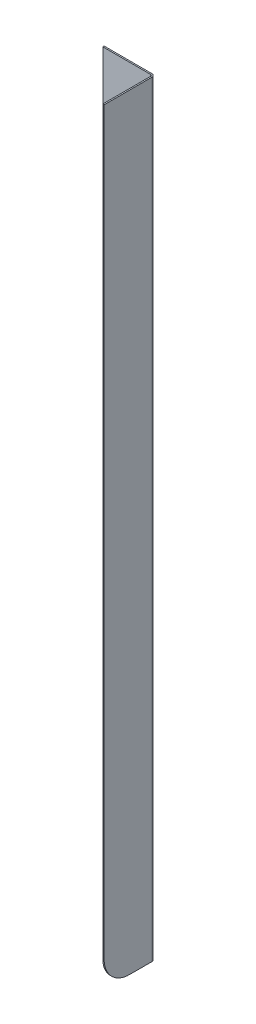
ISO-10303-21;
HEADER;
FILE_DESCRIPTION(('STEP AP214'),'2;1');
FILE_NAME('part.step','',(''),(''),'','','');
FILE_SCHEMA(('AUTOMOTIVE_DESIGN { 1 0 10303 214 1 1 1 1 }'));
ENDSEC;
DATA;
#1=APPLICATION_CONTEXT('core data for automotive mechanical design processes');
#2=APPLICATION_PROTOCOL_DEFINITION('international standard','automotive_design',2000,#1);
#3=PRODUCT_CONTEXT('',#1,'mechanical');
#4=PRODUCT('Part','Part','',(#3));
#5=PRODUCT_RELATED_PRODUCT_CATEGORY('part','',(#4));
#6=PRODUCT_DEFINITION_FORMATION('','',#4);
#7=PRODUCT_DEFINITION_CONTEXT('part definition',#1,'design');
#8=PRODUCT_DEFINITION('design','',#6,#7);
#9=PRODUCT_DEFINITION_SHAPE('','',#8);
#10=(LENGTH_UNIT() NAMED_UNIT(*) SI_UNIT(.MILLI.,.METRE.));
#11=(NAMED_UNIT(*) PLANE_ANGLE_UNIT() SI_UNIT($,.RADIAN.));
#12=(NAMED_UNIT(*) SI_UNIT($,.STERADIAN.) SOLID_ANGLE_UNIT());
#13=UNCERTAINTY_MEASURE_WITH_UNIT(LENGTH_MEASURE(1.E-05),#10,'distance_accuracy_value','');
#14=(GEOMETRIC_REPRESENTATION_CONTEXT(3) GLOBAL_UNCERTAINTY_ASSIGNED_CONTEXT((#13)) GLOBAL_UNIT_ASSIGNED_CONTEXT((#10,
#11,#12)) REPRESENTATION_CONTEXT('',''));
#15=CARTESIAN_POINT('',(0.,0.,0.));
#16=DIRECTION('',(0.,0.,1.));
#17=DIRECTION('',(1.,0.,0.));
#18=AXIS2_PLACEMENT_3D('',#15,#16,#17);
#19=CARTESIAN_POINT('',(0.700442571243631,-210.,-14.2995574287564));
#20=DIRECTION('',(-1.,0.,0.));
#21=DIRECTION('',(0.,0.,1.));
#22=AXIS2_PLACEMENT_3D('',#19,#20,#21);
#23=PLANE('',#22);
#24=DIRECTION('',(0.,0.,1.));
#25=VECTOR('',#24,1.);
#26=CARTESIAN_POINT('',(0.700442571243632,-225.,-14.2995574287563));
#27=LINE('',#26,#25);
#28=CARTESIAN_POINT('',(0.700442571243579,-225.,1.00000000000001));
#29=VERTEX_POINT('',#28);
#30=CARTESIAN_POINT('',(0.700442571243533,-225.,14.1004425712435));
#31=VERTEX_POINT('',#30);
#32=EDGE_CURVE('E48',#29,#31,#27,.T.);
#33=ORIENTED_EDGE('',*,*,#32,.F.);
#34=DIRECTION('',(0.,1.,0.));
#35=VECTOR('',#34,1.);
#36=CARTESIAN_POINT('',(0.700442571243577,-210.,1.00000000000003));
#37=LINE('',#36,#35);
#38=CARTESIAN_POINT('',(0.700442571243552,225.,1.00000000000008));
#39=VERTEX_POINT('',#38);
#40=EDGE_CURVE('E147',#29,#39,#37,.T.);
#41=ORIENTED_EDGE('',*,*,#40,.T.);
#42=DIRECTION('',(0.,0.,-1.));
#43=VECTOR('',#42,1.);
#44=CARTESIAN_POINT('',(0.700442571243633,225.,-29.2995574287564));
#45=LINE('',#44,#43);
#46=CARTESIAN_POINT('',(0.700442571243429,225.,29.1004425712436));
#47=VERTEX_POINT('',#46);
#48=EDGE_CURVE('E180',#47,#39,#45,.T.);
#49=ORIENTED_EDGE('',*,*,#48,.F.);
#50=DIRECTION('',(0.,1.,0.));
#51=VECTOR('',#50,1.);
#52=CARTESIAN_POINT('',(0.700442571243429,225.,29.1004425712436));
#53=LINE('',#52,#51);
#54=CARTESIAN_POINT('',(0.700442571243479,-210.,29.1004425712436));
#55=VERTEX_POINT('',#54);
#56=EDGE_CURVE('E177',#55,#47,#53,.T.);
#57=ORIENTED_EDGE('',*,*,#56,.F.);
#58=CARTESIAN_POINT('',(0.700442571243532,-210.,14.1004425712436));
#59=DIRECTION('',(-1.,0.,0.));
#60=DIRECTION('',(0.,0.,1.));
#61=AXIS2_PLACEMENT_3D('',#58,#59,#60);
#62=CIRCLE('',#61,15.);
#63=EDGE_CURVE('E174',#31,#55,#62,.T.);
#64=ORIENTED_EDGE('',*,*,#63,.F.);
#65=EDGE_LOOP('',(#33,#41,#49,#57,#64));
#66=FACE_BOUND('',#65,.T.);
#67=ADVANCED_FACE('F44',(#66),#23,.F.);
#68=CARTESIAN_POINT('',(0.700442571243633,225.,-29.2995574287564));
#69=DIRECTION('',(0.,1.,0.));
#70=DIRECTION('',(-1.,0.,0.));
#71=AXIS2_PLACEMENT_3D('',#68,#69,#70);
#72=PLANE('',#71);
#73=DIRECTION('',(1.,0.,0.));
#74=VECTOR('',#73,1.);
#75=CARTESIAN_POINT('',(0.700442571243527,225.,1.00000000000003));
#76=LINE('',#75,#74);
#77=CARTESIAN_POINT('',(-0.0995574287564731,225.,1.00000000000006));
#78=VERTEX_POINT('',#77);
#79=EDGE_CURVE('E12',#78,#39,#76,.T.);
#80=ORIENTED_EDGE('',*,*,#79,.F.);
#81=DIRECTION('',(0.,0.,-1.));
#82=VECTOR('',#81,1.);
#83=CARTESIAN_POINT('',(-0.0995574287563673,225.,-29.2995574287564));
#84=LINE('',#83,#82);
#85=CARTESIAN_POINT('',(-0.0995574287565712,225.,29.1004425712436));
#86=VERTEX_POINT('',#85);
#87=EDGE_CURVE('E61',#86,#78,#84,.T.);
#88=ORIENTED_EDGE('',*,*,#87,.F.);
#89=DIRECTION('',(-1.,0.,0.));
#90=VECTOR('',#89,1.);
#91=CARTESIAN_POINT('',(0.700442571243429,225.,29.1004425712436));
#92=LINE('',#91,#90);
#93=EDGE_CURVE('E186',#47,#86,#92,.T.);
#94=ORIENTED_EDGE('',*,*,#93,.F.);
#95=ORIENTED_EDGE('',*,*,#48,.T.);
#96=EDGE_LOOP('',(#80,#88,#94,#95));
#97=FACE_BOUND('',#96,.T.);
#98=ADVANCED_FACE('F46',(#97),#72,.T.);
#99=CARTESIAN_POINT('',(0.700442571243429,225.,29.1004425712436));
#100=DIRECTION('',(0.,0.,1.));
#101=DIRECTION('',(0.,1.,0.));
#102=AXIS2_PLACEMENT_3D('',#99,#100,#101);
#103=PLANE('',#102);
#104=DIRECTION('',(0.,1.,0.));
#105=VECTOR('',#104,1.);
#106=CARTESIAN_POINT('',(-0.0995574287565712,225.,29.1004425712436));
#107=LINE('',#106,#105);
#108=CARTESIAN_POINT('',(-0.0995574287565209,-210.,29.1004425712436));
#109=VERTEX_POINT('',#108);
#110=EDGE_CURVE('E184',#109,#86,#107,.T.);
#111=ORIENTED_EDGE('',*,*,#110,.F.);
#112=DIRECTION('',(-1.,0.,0.));
#113=VECTOR('',#112,1.);
#114=CARTESIAN_POINT('',(0.700442571243479,-210.,29.1004425712436));
#115=LINE('',#114,#113);
#116=EDGE_CURVE('E188',#55,#109,#115,.T.);
#117=ORIENTED_EDGE('',*,*,#116,.F.);
#118=ORIENTED_EDGE('',*,*,#56,.T.);
#119=ORIENTED_EDGE('',*,*,#93,.T.);
#120=EDGE_LOOP('',(#111,#117,#118,#119));
#121=FACE_BOUND('',#120,.T.);
#122=ADVANCED_FACE('F245',(#121),#103,.T.);
#123=CARTESIAN_POINT('',(0.700442571243532,-210.,14.1004425712436));
#124=DIRECTION('',(-1.,0.,0.));
#125=DIRECTION('',(0.,0.,1.));
#126=AXIS2_PLACEMENT_3D('',#123,#124,#125);
#127=CYLINDRICAL_SURFACE('',#126,15.);
#128=CARTESIAN_POINT('',(-0.0995574287564685,-210.,14.1004425712436));
#129=DIRECTION('',(-1.,0.,0.));
#130=DIRECTION('',(0.,0.,1.));
#131=AXIS2_PLACEMENT_3D('',#128,#129,#130);
#132=CIRCLE('',#131,15.);
#133=CARTESIAN_POINT('',(-0.0995574287564668,-225.,14.1004425712435));
#134=VERTEX_POINT('',#133);
#135=EDGE_CURVE('E181',#134,#109,#132,.T.);
#136=ORIENTED_EDGE('',*,*,#135,.F.);
#137=DIRECTION('',(-1.,0.,0.));
#138=VECTOR('',#137,1.);
#139=CARTESIAN_POINT('',(0.700442571243533,-225.,14.1004425712435));
#140=LINE('',#139,#138);
#141=EDGE_CURVE('E190',#31,#134,#140,.T.);
#142=ORIENTED_EDGE('',*,*,#141,.F.);
#143=ORIENTED_EDGE('',*,*,#63,.T.);
#144=ORIENTED_EDGE('',*,*,#116,.T.);
#145=EDGE_LOOP('',(#136,#142,#143,#144));
#146=FACE_BOUND('',#145,.T.);
#147=ADVANCED_FACE('F249',(#146),#127,.T.);
#148=CARTESIAN_POINT('',(0.700442571243632,-225.,-14.2995574287563));
#149=DIRECTION('',(0.,-1.,0.));
#150=DIRECTION('',(1.,0.,0.));
#151=AXIS2_PLACEMENT_3D('',#148,#149,#150);
#152=PLANE('',#151);
#153=DIRECTION('',(-1.,0.,0.));
#154=VECTOR('',#153,1.);
#155=CARTESIAN_POINT('',(0.700442571243579,-225.,1.00000000000003));
#156=LINE('',#155,#154);
#157=CARTESIAN_POINT('',(-0.099557428756421,-225.,1.));
#158=VERTEX_POINT('',#157);
#159=EDGE_CURVE('E193',#29,#158,#156,.T.);
#160=ORIENTED_EDGE('',*,*,#159,.F.);
#161=ORIENTED_EDGE('',*,*,#32,.T.);
#162=ORIENTED_EDGE('',*,*,#141,.T.);
#163=DIRECTION('',(0.,0.,1.));
#164=VECTOR('',#163,1.);
#165=CARTESIAN_POINT('',(-0.0995574287563676,-225.,-14.2995574287563));
#166=LINE('',#165,#164);
#167=EDGE_CURVE('E69',#158,#134,#166,.T.);
#168=ORIENTED_EDGE('',*,*,#167,.F.);
#169=EDGE_LOOP('',(#160,#161,#162,#168));
#170=FACE_BOUND('',#169,.T.);
#171=ADVANCED_FACE('F237',(#170),#152,.T.);
#172=CARTESIAN_POINT('',(-0.0995574287563694,-210.,-14.2995574287564));
#173=DIRECTION('',(-1.,0.,0.));
#174=DIRECTION('',(0.,0.,1.));
#175=AXIS2_PLACEMENT_3D('',#172,#173,#174);
#176=PLANE('',#175);
#177=DIRECTION('',(0.,1.,0.));
#178=VECTOR('',#177,1.);
#179=CARTESIAN_POINT('',(-0.0995574287564228,-210.,1.00000000000003));
#180=LINE('',#179,#178);
#181=EDGE_CURVE('E53',#158,#78,#180,.T.);
#182=ORIENTED_EDGE('',*,*,#181,.F.);
#183=ORIENTED_EDGE('',*,*,#167,.T.);
#184=ORIENTED_EDGE('',*,*,#135,.T.);
#185=ORIENTED_EDGE('',*,*,#110,.T.);
#186=ORIENTED_EDGE('',*,*,#87,.T.);
#187=EDGE_LOOP('',(#182,#183,#184,#185,#186));
#188=FACE_BOUND('',#187,.T.);
#189=ADVANCED_FACE('F230',(#188),#176,.T.);
#190=CARTESIAN_POINT('',(-29.2,225.,-0.8));
#191=DIRECTION('',(-1.,0.,0.));
#192=DIRECTION('',(0.,-1.,0.));
#193=AXIS2_PLACEMENT_3D('',#190,#191,#192);
#194=PLANE('',#193);
#195=DIRECTION('',(0.,-1.,0.));
#196=VECTOR('',#195,1.);
#197=CARTESIAN_POINT('',(-29.2,225.,0.));
#198=LINE('',#197,#196);
#199=CARTESIAN_POINT('',(-29.2,225.,0.));
#200=VERTEX_POINT('',#199);
#201=CARTESIAN_POINT('',(-29.2,-210.,0.));
#202=VERTEX_POINT('',#201);
#203=EDGE_CURVE('E214',#200,#202,#198,.T.);
#204=ORIENTED_EDGE('',*,*,#203,.F.);
#205=DIRECTION('',(0.,0.,1.));
#206=VECTOR('',#205,1.);
#207=CARTESIAN_POINT('',(-29.2,225.,-0.8));
#208=LINE('',#207,#206);
#209=CARTESIAN_POINT('',(-29.2,225.,-0.8));
#210=VERTEX_POINT('',#209);
#211=EDGE_CURVE('E198',#210,#200,#208,.T.);
#212=ORIENTED_EDGE('',*,*,#211,.F.);
#213=DIRECTION('',(0.,-1.,0.));
#214=VECTOR('',#213,1.);
#215=CARTESIAN_POINT('',(-29.2,225.,-0.8));
#216=LINE('',#215,#214);
#217=CARTESIAN_POINT('',(-29.2,-210.,-0.8));
#218=VERTEX_POINT('',#217);
#219=EDGE_CURVE('E160',#210,#218,#216,.T.);
#220=ORIENTED_EDGE('',*,*,#219,.T.);
#221=DIRECTION('',(0.,0.,1.));
#222=VECTOR('',#221,1.);
#223=CARTESIAN_POINT('',(-29.2,-210.,-0.8));
#224=LINE('',#223,#222);
#225=EDGE_CURVE('E170',#218,#202,#224,.T.);
#226=ORIENTED_EDGE('',*,*,#225,.T.);
#227=EDGE_LOOP('',(#204,#212,#220,#226));
#228=FACE_BOUND('',#227,.T.);
#229=ADVANCED_FACE('F228',(#228),#194,.T.);
#230=CARTESIAN_POINT('',(-14.2,-210.,-0.8));
#231=DIRECTION('',(0.,0.,1.));
#232=DIRECTION('',(1.,0.,0.));
#233=AXIS2_PLACEMENT_3D('',#230,#231,#232);
#234=CYLINDRICAL_SURFACE('',#233,15.);
#235=CARTESIAN_POINT('',(-14.2,-210.,0.));
#236=DIRECTION('',(0.,0.,1.));
#237=DIRECTION('',(1.,0.,0.));
#238=AXIS2_PLACEMENT_3D('',#235,#236,#237);
#239=CIRCLE('',#238,15.);
#240=CARTESIAN_POINT('',(-14.1999999999999,-225.,0.));
#241=VERTEX_POINT('',#240);
#242=EDGE_CURVE('E211',#202,#241,#239,.T.);
#243=ORIENTED_EDGE('',*,*,#242,.F.);
#244=ORIENTED_EDGE('',*,*,#225,.F.);
#245=CARTESIAN_POINT('',(-14.2,-210.,-0.8));
#246=DIRECTION('',(0.,0.,1.));
#247=DIRECTION('',(1.,0.,0.));
#248=AXIS2_PLACEMENT_3D('',#245,#246,#247);
#249=CIRCLE('',#248,15.);
#250=CARTESIAN_POINT('',(-14.1999999999999,-225.,-0.8));
#251=VERTEX_POINT('',#250);
#252=EDGE_CURVE('E165',#218,#251,#249,.T.);
#253=ORIENTED_EDGE('',*,*,#252,.T.);
#254=DIRECTION('',(0.,0.,1.));
#255=VECTOR('',#254,1.);
#256=CARTESIAN_POINT('',(-14.1999999999999,-225.,-0.8));
#257=LINE('',#256,#255);
#258=EDGE_CURVE('E163',#251,#241,#257,.T.);
#259=ORIENTED_EDGE('',*,*,#258,.T.);
#260=EDGE_LOOP('',(#243,#244,#253,#259));
#261=FACE_BOUND('',#260,.T.);
#262=ADVANCED_FACE('F226',(#261),#234,.T.);
#263=CARTESIAN_POINT('',(-14.2,-210.,-0.8));
#264=DIRECTION('',(0.,0.,1.));
#265=DIRECTION('',(1.,0.,0.));
#266=AXIS2_PLACEMENT_3D('',#263,#264,#265);
#267=PLANE('',#266);
#268=DIRECTION('',(0.,1.,0.));
#269=VECTOR('',#268,1.);
#270=CARTESIAN_POINT('',(-1.0995574287564,-210.,-0.8));
#271=LINE('',#270,#269);
#272=CARTESIAN_POINT('',(-1.09955742875642,-225.,-0.8));
#273=VERTEX_POINT('',#272);
#274=CARTESIAN_POINT('',(-1.0995574287564,225.,-0.8));
#275=VERTEX_POINT('',#274);
#276=EDGE_CURVE('E144',#273,#275,#271,.T.);
#277=ORIENTED_EDGE('',*,*,#276,.F.);
#278=DIRECTION('',(1.,0.,0.));
#279=VECTOR('',#278,1.);
#280=CARTESIAN_POINT('',(-14.1999999999999,-225.,-0.8));
#281=LINE('',#280,#279);
#282=EDGE_CURVE('E138',#251,#273,#281,.T.);
#283=ORIENTED_EDGE('',*,*,#282,.F.);
#284=ORIENTED_EDGE('',*,*,#252,.F.);
#285=ORIENTED_EDGE('',*,*,#219,.F.);
#286=DIRECTION('',(-1.,0.,0.));
#287=VECTOR('',#286,1.);
#288=CARTESIAN_POINT('',(-29.2,225.,-0.8));
#289=LINE('',#288,#287);
#290=EDGE_CURVE('E158',#275,#210,#289,.T.);
#291=ORIENTED_EDGE('',*,*,#290,.F.);
#292=EDGE_LOOP('',(#277,#283,#284,#285,#291));
#293=FACE_BOUND('',#292,.T.);
#294=ADVANCED_FACE('F154',(#293),#267,.F.);
#295=CARTESIAN_POINT('',(-14.1999999999999,-225.,-0.8));
#296=DIRECTION('',(0.,-1.,0.));
#297=DIRECTION('',(0.,0.,-1.));
#298=AXIS2_PLACEMENT_3D('',#295,#296,#297);
#299=PLANE('',#298);
#300=ORIENTED_EDGE('',*,*,#282,.T.);
#301=DIRECTION('',(0.,0.,1.));
#302=VECTOR('',#301,1.);
#303=CARTESIAN_POINT('',(-1.0995574287564,-225.,-0.8));
#304=LINE('',#303,#302);
#305=CARTESIAN_POINT('',(-1.0995574287564,-225.,0.));
#306=VERTEX_POINT('',#305);
#307=EDGE_CURVE('E125',#273,#306,#304,.T.);
#308=ORIENTED_EDGE('',*,*,#307,.T.);
#309=DIRECTION('',(1.,0.,0.));
#310=VECTOR('',#309,1.);
#311=CARTESIAN_POINT('',(-14.1999999999999,-225.,0.));
#312=LINE('',#311,#310);
#313=EDGE_CURVE('E137',#241,#306,#312,.T.);
#314=ORIENTED_EDGE('',*,*,#313,.F.);
#315=ORIENTED_EDGE('',*,*,#258,.F.);
#316=EDGE_LOOP('',(#300,#308,#314,#315));
#317=FACE_BOUND('',#316,.T.);
#318=ADVANCED_FACE('F162',(#317),#299,.T.);
#319=CARTESIAN_POINT('',(-14.2,-210.,0.));
#320=DIRECTION('',(0.,0.,1.));
#321=DIRECTION('',(1.,0.,0.));
#322=AXIS2_PLACEMENT_3D('',#319,#320,#321);
#323=PLANE('',#322);
#324=ORIENTED_EDGE('',*,*,#313,.T.);
#325=DIRECTION('',(0.,1.,0.));
#326=VECTOR('',#325,1.);
#327=CARTESIAN_POINT('',(-1.0995574287564,-210.,0.));
#328=LINE('',#327,#326);
#329=CARTESIAN_POINT('',(-1.09955742875644,225.,0.));
#330=VERTEX_POINT('',#329);
#331=EDGE_CURVE('E219',#306,#330,#328,.T.);
#332=ORIENTED_EDGE('',*,*,#331,.T.);
#333=DIRECTION('',(-1.,0.,0.));
#334=VECTOR('',#333,1.);
#335=CARTESIAN_POINT('',(-29.2,225.,0.));
#336=LINE('',#335,#334);
#337=EDGE_CURVE('E217',#330,#200,#336,.T.);
#338=ORIENTED_EDGE('',*,*,#337,.T.);
#339=ORIENTED_EDGE('',*,*,#203,.T.);
#340=ORIENTED_EDGE('',*,*,#242,.T.);
#341=EDGE_LOOP('',(#324,#332,#338,#339,#340));
#342=FACE_BOUND('',#341,.T.);
#343=ADVANCED_FACE('F223',(#342),#323,.T.);
#344=CARTESIAN_POINT('',(-29.2,225.,-0.8));
#345=DIRECTION('',(0.,1.,0.));
#346=DIRECTION('',(0.,0.,1.));
#347=AXIS2_PLACEMENT_3D('',#344,#345,#346);
#348=PLANE('',#347);
#349=ORIENTED_EDGE('',*,*,#337,.F.);
#350=DIRECTION('',(0.,0.,-1.));
#351=VECTOR('',#350,1.);
#352=CARTESIAN_POINT('',(-1.09955742875645,225.,-0.8));
#353=LINE('',#352,#351);
#354=EDGE_CURVE('E205',#330,#275,#353,.T.);
#355=ORIENTED_EDGE('',*,*,#354,.T.);
#356=ORIENTED_EDGE('',*,*,#290,.T.);
#357=ORIENTED_EDGE('',*,*,#211,.T.);
#358=EDGE_LOOP('',(#349,#355,#356,#357));
#359=FACE_BOUND('',#358,.T.);
#360=ADVANCED_FACE('F274',(#359),#348,.T.);
#361=CARTESIAN_POINT('',(-1.0995574287564,-225.,1.));
#362=DIRECTION('',(0.,-1.,0.));
#363=DIRECTION('',(0.,0.,-1.));
#364=AXIS2_PLACEMENT_3D('',#361,#362,#363);
#365=PLANE('',#364);
#366=ORIENTED_EDGE('',*,*,#159,.T.);
#367=CARTESIAN_POINT('',(-1.0995574287564,-225.,1.));
#368=DIRECTION('',(0.,-1.,0.));
#369=DIRECTION('',(1.,0.,0.));
#370=AXIS2_PLACEMENT_3D('',#367,#368,#369);
#371=CIRCLE('',#370,1.);
#372=EDGE_CURVE('E132',#158,#306,#371,.F.);
#373=ORIENTED_EDGE('',*,*,#372,.T.);
#374=ORIENTED_EDGE('',*,*,#307,.F.);
#375=CARTESIAN_POINT('',(-1.0995574287564,-225.,1.));
#376=DIRECTION('',(0.,1.,0.));
#377=DIRECTION('',(0.,0.,-1.));
#378=AXIS2_PLACEMENT_3D('',#375,#376,#377);
#379=CIRCLE('',#378,1.8);
#380=EDGE_CURVE('E129',#29,#273,#379,.T.);
#381=ORIENTED_EDGE('',*,*,#380,.F.);
#382=EDGE_LOOP('',(#366,#373,#374,#381));
#383=FACE_BOUND('',#382,.T.);
#384=ADVANCED_FACE('F128',(#383),#365,.T.);
#385=CARTESIAN_POINT('',(-1.09955742875645,225.,1.));
#386=DIRECTION('',(0.,1.,0.));
#387=DIRECTION('',(0.,0.,1.));
#388=AXIS2_PLACEMENT_3D('',#385,#386,#387);
#389=PLANE('',#388);
#390=ORIENTED_EDGE('',*,*,#354,.F.);
#391=CARTESIAN_POINT('',(-1.09955742875645,225.,1.));
#392=DIRECTION('',(0.,-1.,0.));
#393=DIRECTION('',(1.,0.,0.));
#394=AXIS2_PLACEMENT_3D('',#391,#392,#393);
#395=CIRCLE('',#394,1.);
#396=EDGE_CURVE('E149',#330,#78,#395,.T.);
#397=ORIENTED_EDGE('',*,*,#396,.T.);
#398=ORIENTED_EDGE('',*,*,#79,.T.);
#399=CARTESIAN_POINT('',(-1.09955742875645,225.,1.));
#400=DIRECTION('',(0.,-1.,0.));
#401=DIRECTION('',(0.,0.,1.));
#402=AXIS2_PLACEMENT_3D('',#399,#400,#401);
#403=CIRCLE('',#402,1.8);
#404=EDGE_CURVE('E148',#275,#39,#403,.T.);
#405=ORIENTED_EDGE('',*,*,#404,.F.);
#406=EDGE_LOOP('',(#390,#397,#398,#405));
#407=FACE_BOUND('',#406,.T.);
#408=ADVANCED_FACE('F263',(#407),#389,.T.);
#409=CARTESIAN_POINT('',(-1.09955742875647,450.006084521261,1.));
#410=DIRECTION('',(0.,-1.,0.));
#411=DIRECTION('',(1.,0.,0.));
#412=AXIS2_PLACEMENT_3D('',#409,#410,#411);
#413=CYLINDRICAL_SURFACE('',#412,1.8);
#414=ORIENTED_EDGE('',*,*,#404,.T.);
#415=ORIENTED_EDGE('',*,*,#40,.F.);
#416=ORIENTED_EDGE('',*,*,#380,.T.);
#417=ORIENTED_EDGE('',*,*,#276,.T.);
#418=EDGE_LOOP('',(#414,#415,#416,#417));
#419=FACE_BOUND('',#418,.T.);
#420=ADVANCED_FACE('F143',(#419),#413,.T.);
#421=CARTESIAN_POINT('',(-1.09955742875647,450.006084521261,1.));
#422=DIRECTION('',(0.,-1.,0.));
#423=DIRECTION('',(1.,0.,0.));
#424=AXIS2_PLACEMENT_3D('',#421,#422,#423);
#425=CYLINDRICAL_SURFACE('',#424,1.);
#426=ORIENTED_EDGE('',*,*,#396,.F.);
#427=ORIENTED_EDGE('',*,*,#331,.F.);
#428=ORIENTED_EDGE('',*,*,#372,.F.);
#429=ORIENTED_EDGE('',*,*,#181,.T.);
#430=EDGE_LOOP('',(#426,#427,#428,#429));
#431=FACE_BOUND('',#430,.T.);
#432=ADVANCED_FACE('F259',(#431),#425,.F.);
#433=CLOSED_SHELL('',(#67,#98,#122,#147,#171,#189,#229,#262,#294,#318,#343,#360,#384,#408,#420,#432));
#434=MANIFOLD_SOLID_BREP('B2',#433);
#435=ADVANCED_BREP_SHAPE_REPRESENTATION('',(#18,#434),#14);
#436=SHAPE_DEFINITION_REPRESENTATION(#9,#435);
ENDSEC;
END-ISO-10303-21;
